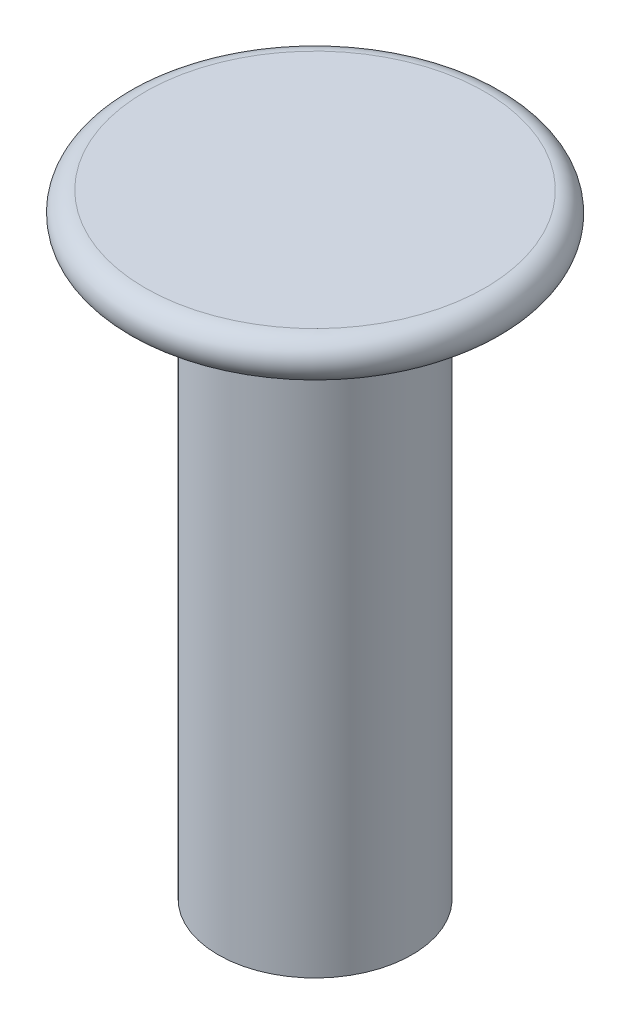
ISO-10303-21;
HEADER;
FILE_DESCRIPTION(('STEP AP214'),'2;1');
FILE_NAME('part.step','',(''),(''),'','','');
FILE_SCHEMA(('AUTOMOTIVE_DESIGN { 1 0 10303 214 1 1 1 1 }'));
ENDSEC;
DATA;
#1=APPLICATION_CONTEXT('core data for automotive mechanical design processes');
#2=APPLICATION_PROTOCOL_DEFINITION('international standard','automotive_design',2000,#1);
#3=PRODUCT_CONTEXT('',#1,'mechanical');
#4=PRODUCT('Part','Part','',(#3));
#5=PRODUCT_RELATED_PRODUCT_CATEGORY('part','',(#4));
#6=PRODUCT_DEFINITION_FORMATION('','',#4);
#7=PRODUCT_DEFINITION_CONTEXT('part definition',#1,'design');
#8=PRODUCT_DEFINITION('design','',#6,#7);
#9=PRODUCT_DEFINITION_SHAPE('','',#8);
#10=(LENGTH_UNIT() NAMED_UNIT(*) SI_UNIT(.MILLI.,.METRE.));
#11=(NAMED_UNIT(*) PLANE_ANGLE_UNIT() SI_UNIT($,.RADIAN.));
#12=(NAMED_UNIT(*) SI_UNIT($,.STERADIAN.) SOLID_ANGLE_UNIT());
#13=UNCERTAINTY_MEASURE_WITH_UNIT(LENGTH_MEASURE(1.E-05),#10,'distance_accuracy_value','');
#14=(GEOMETRIC_REPRESENTATION_CONTEXT(3) GLOBAL_UNCERTAINTY_ASSIGNED_CONTEXT((#13)) GLOBAL_UNIT_ASSIGNED_CONTEXT((#10,
#11,#12)) REPRESENTATION_CONTEXT('',''));
#15=CARTESIAN_POINT('',(0.,0.,0.));
#16=DIRECTION('',(0.,0.,1.));
#17=DIRECTION('',(1.,0.,0.));
#18=AXIS2_PLACEMENT_3D('',#15,#16,#17);
#19=CARTESIAN_POINT('',(0.,0.,0.));
#20=DIRECTION('',(0.,-1.,0.));
#21=DIRECTION('',(0.,0.,-1.));
#22=AXIS2_PLACEMENT_3D('',#19,#20,#21);
#23=PLANE('',#22);
#24=CARTESIAN_POINT('',(0.,0.,0.));
#25=DIRECTION('',(0.,1.,0.));
#26=DIRECTION('',(0.,0.,1.));
#27=AXIS2_PLACEMENT_3D('',#24,#25,#26);
#28=CIRCLE('',#27,2.78366020445437);
#29=CARTESIAN_POINT('',(0.,0.,2.78366020445437));
#30=VERTEX_POINT('',#29);
#31=EDGE_CURVE('E10',#30,#30,#28,.T.);
#32=ORIENTED_EDGE('',*,*,#31,.T.);
#33=EDGE_LOOP('',(#32));
#34=FACE_BOUND('',#33,.T.);
#35=ADVANCED_FACE('F30',(#34),#23,.F.);
#36=CARTESIAN_POINT('',(0.,-0.327839795545645,0.));
#37=DIRECTION('',(0.,1.,0.));
#38=DIRECTION('',(0.,0.,1.));
#39=AXIS2_PLACEMENT_3D('',#36,#37,#38);
#40=TOROIDAL_SURFACE('',#39,2.78366020445437,0.327839795545645);
#41=ORIENTED_EDGE('',*,*,#31,.F.);
#42=EDGE_LOOP('',(#41));
#43=FACE_BOUND('',#42,.T.);
#44=CARTESIAN_POINT('',(0.,-0.611757386859674,0.));
#45=DIRECTION('',(0.,1.,0.));
#46=DIRECTION('',(0.,0.,1.));
#47=AXIS2_PLACEMENT_3D('',#44,#45,#46);
#48=CIRCLE('',#47,2.94758010222719);
#49=CARTESIAN_POINT('',(0.,-0.611757386859674,2.94758010222719));
#50=VERTEX_POINT('',#49);
#51=EDGE_CURVE('E36',#50,#50,#48,.T.);
#52=ORIENTED_EDGE('',*,*,#51,.T.);
#53=EDGE_LOOP('',(#52));
#54=FACE_BOUND('',#53,.T.);
#55=ADVANCED_FACE('F62',(#43,#54),#40,.T.);
#56=CARTESIAN_POINT('',(0.,-1.397,0.));
#57=DIRECTION('',(0.,1.,0.));
#58=DIRECTION('',(0.,0.,1.));
#59=AXIS2_PLACEMENT_3D('',#56,#57,#58);
#60=CONICAL_SURFACE('',#59,1.5875,1.0471975511966);
#61=ORIENTED_EDGE('',*,*,#51,.F.);
#62=EDGE_LOOP('',(#61));
#63=FACE_BOUND('',#62,.T.);
#64=CARTESIAN_POINT('',(0.,-1.397,0.));
#65=DIRECTION('',(0.,1.,0.));
#66=DIRECTION('',(0.,0.,1.));
#67=AXIS2_PLACEMENT_3D('',#64,#65,#66);
#68=CIRCLE('',#67,1.5875);
#69=CARTESIAN_POINT('',(0.,-1.397,1.5875));
#70=VERTEX_POINT('',#69);
#71=EDGE_CURVE('E40',#70,#70,#68,.T.);
#72=ORIENTED_EDGE('',*,*,#71,.T.);
#73=EDGE_LOOP('',(#72));
#74=FACE_BOUND('',#73,.T.);
#75=ADVANCED_FACE('F58',(#63,#74),#60,.T.);
#76=CARTESIAN_POINT('',(0.,94.6088814411395,0.));
#77=DIRECTION('',(0.,1.,0.));
#78=DIRECTION('',(0.,0.,1.));
#79=AXIS2_PLACEMENT_3D('',#76,#77,#78);
#80=CYLINDRICAL_SURFACE('',#79,1.5875);
#81=ORIENTED_EDGE('',*,*,#71,.F.);
#82=EDGE_LOOP('',(#81));
#83=FACE_BOUND('',#82,.T.);
#84=CARTESIAN_POINT('',(0.,-10.0584,0.));
#85=DIRECTION('',(0.,1.,0.));
#86=DIRECTION('',(0.,0.,1.));
#87=AXIS2_PLACEMENT_3D('',#84,#85,#86);
#88=CIRCLE('',#87,1.5875);
#89=CARTESIAN_POINT('',(0.,-10.0584,1.5875));
#90=VERTEX_POINT('',#89);
#91=EDGE_CURVE('E44',#90,#90,#88,.T.);
#92=ORIENTED_EDGE('',*,*,#91,.T.);
#93=EDGE_LOOP('',(#92));
#94=FACE_BOUND('',#93,.T.);
#95=ADVANCED_FACE('F50',(#83,#94),#80,.T.);
#96=CARTESIAN_POINT('',(1.5875,-10.0584,0.));
#97=DIRECTION('',(0.,1.,0.));
#98=DIRECTION('',(0.,0.,1.));
#99=AXIS2_PLACEMENT_3D('',#96,#97,#98);
#100=PLANE('',#99);
#101=ORIENTED_EDGE('',*,*,#91,.F.);
#102=EDGE_LOOP('',(#101));
#103=FACE_BOUND('',#102,.T.);
#104=ADVANCED_FACE('F52',(#103),#100,.F.);
#105=CLOSED_SHELL('',(#35,#55,#75,#95,#104));
#106=MANIFOLD_SOLID_BREP('B2',#105);
#107=ADVANCED_BREP_SHAPE_REPRESENTATION('',(#18,#106),#14);
#108=SHAPE_DEFINITION_REPRESENTATION(#9,#107);
ENDSEC;
END-ISO-10303-21;
